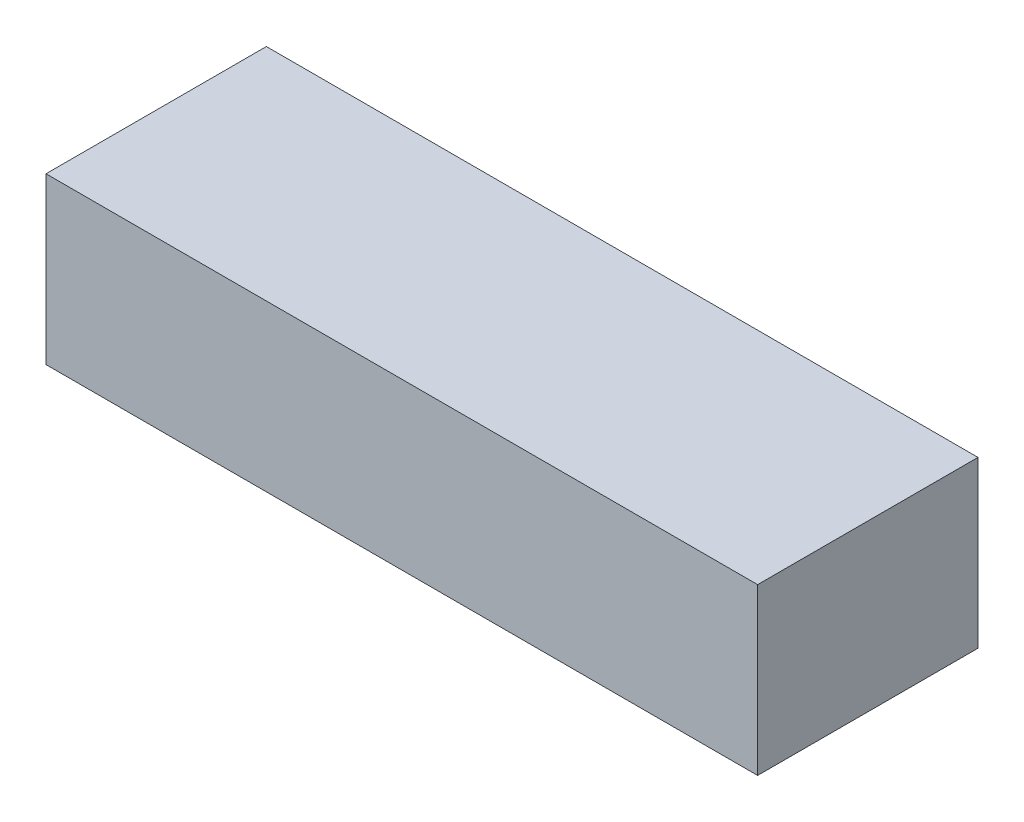
ISO-10303-21;
HEADER;
FILE_DESCRIPTION(('STEP AP214'),'2;1');
FILE_NAME('part.step','',(''),(''),'','','');
FILE_SCHEMA(('AUTOMOTIVE_DESIGN { 1 0 10303 214 1 1 1 1 }'));
ENDSEC;
DATA;
#1=APPLICATION_CONTEXT('core data for automotive mechanical design processes');
#2=APPLICATION_PROTOCOL_DEFINITION('international standard','automotive_design',2000,#1);
#3=PRODUCT_CONTEXT('',#1,'mechanical');
#4=PRODUCT('Part','Part','',(#3));
#5=PRODUCT_RELATED_PRODUCT_CATEGORY('part','',(#4));
#6=PRODUCT_DEFINITION_FORMATION('','',#4);
#7=PRODUCT_DEFINITION_CONTEXT('part definition',#1,'design');
#8=PRODUCT_DEFINITION('design','',#6,#7);
#9=PRODUCT_DEFINITION_SHAPE('','',#8);
#10=(LENGTH_UNIT() NAMED_UNIT(*) SI_UNIT(.MILLI.,.METRE.));
#11=(NAMED_UNIT(*) PLANE_ANGLE_UNIT() SI_UNIT($,.RADIAN.));
#12=(NAMED_UNIT(*) SI_UNIT($,.STERADIAN.) SOLID_ANGLE_UNIT());
#13=UNCERTAINTY_MEASURE_WITH_UNIT(LENGTH_MEASURE(1.E-05),#10,'distance_accuracy_value','');
#14=(GEOMETRIC_REPRESENTATION_CONTEXT(3) GLOBAL_UNCERTAINTY_ASSIGNED_CONTEXT((#13)) GLOBAL_UNIT_ASSIGNED_CONTEXT((#10,
#11,#12)) REPRESENTATION_CONTEXT('',''));
#15=CARTESIAN_POINT('',(0.,0.,0.));
#16=DIRECTION('',(0.,0.,1.));
#17=DIRECTION('',(1.,0.,0.));
#18=AXIS2_PLACEMENT_3D('',#15,#16,#17);
#19=CARTESIAN_POINT('',(0.,36.,0.));
#20=DIRECTION('',(1.,0.,0.));
#21=DIRECTION('',(0.,0.,-1.));
#22=AXIS2_PLACEMENT_3D('',#19,#20,#21);
#23=PLANE('',#22);
#24=DIRECTION('',(0.,0.,-1.));
#25=VECTOR('',#24,1.);
#26=CARTESIAN_POINT('',(0.,23.5446486102546,0.));
#27=LINE('',#26,#25);
#28=CARTESIAN_POINT('',(0.,23.5446486102546,11.2079706550077));
#29=VERTEX_POINT('',#28);
#30=CARTESIAN_POINT('',(0.,23.5446486102546,0.));
#31=VERTEX_POINT('',#30);
#32=EDGE_CURVE('E60',#29,#31,#27,.T.);
#33=ORIENTED_EDGE('',*,*,#32,.F.);
#34=DIRECTION('',(0.,1.,0.));
#35=VECTOR('',#34,1.);
#36=CARTESIAN_POINT('',(0.,23.5446486102546,11.2079706550077));
#37=LINE('',#36,#35);
#38=CARTESIAN_POINT('',(0.,12.8736854339166,11.2079706550077));
#39=VERTEX_POINT('',#38);
#40=EDGE_CURVE('E283',#39,#29,#37,.T.);
#41=ORIENTED_EDGE('',*,*,#40,.F.);
#42=DIRECTION('',(0.,0.,1.));
#43=VECTOR('',#42,1.);
#44=CARTESIAN_POINT('',(0.,12.8736854339166,0.));
#45=LINE('',#44,#43);
#46=CARTESIAN_POINT('',(0.,12.8736854339166,0.));
#47=VERTEX_POINT('',#46);
#48=EDGE_CURVE('E66',#47,#39,#45,.T.);
#49=ORIENTED_EDGE('',*,*,#48,.F.);
#50=DIRECTION('',(0.,-1.,0.));
#51=VECTOR('',#50,1.);
#52=CARTESIAN_POINT('',(0.,36.,0.));
#53=LINE('',#52,#51);
#54=CARTESIAN_POINT('',(0.,0.,0.));
#55=VERTEX_POINT('',#54);
#56=EDGE_CURVE('E133',#47,#55,#53,.T.);
#57=ORIENTED_EDGE('',*,*,#56,.T.);
#58=DIRECTION('',(0.,0.,1.));
#59=VECTOR('',#58,1.);
#60=CARTESIAN_POINT('',(0.,0.,0.));
#61=LINE('',#60,#59);
#62=CARTESIAN_POINT('',(0.,0.,48.));
#63=VERTEX_POINT('',#62);
#64=EDGE_CURVE('E135',#55,#63,#61,.T.);
#65=ORIENTED_EDGE('',*,*,#64,.T.);
#66=DIRECTION('',(0.,-1.,0.));
#67=VECTOR('',#66,1.);
#68=CARTESIAN_POINT('',(0.,36.,48.));
#69=LINE('',#68,#67);
#70=CARTESIAN_POINT('',(0.,36.,48.));
#71=VERTEX_POINT('',#70);
#72=EDGE_CURVE('E11',#71,#63,#69,.T.);
#73=ORIENTED_EDGE('',*,*,#72,.F.);
#74=DIRECTION('',(0.,0.,1.));
#75=VECTOR('',#74,1.);
#76=CARTESIAN_POINT('',(0.,36.,0.));
#77=LINE('',#76,#75);
#78=CARTESIAN_POINT('',(0.,36.,0.));
#79=VERTEX_POINT('',#78);
#80=EDGE_CURVE('E146',#79,#71,#77,.T.);
#81=ORIENTED_EDGE('',*,*,#80,.F.);
#82=EDGE_CURVE('E167',#79,#31,#53,.T.);
#83=ORIENTED_EDGE('',*,*,#82,.T.);
#84=EDGE_LOOP('',(#33,#41,#49,#57,#65,#73,#81,#83));
#85=FACE_BOUND('',#84,.T.);
#86=ADVANCED_FACE('F45',(#85),#23,.F.);
#87=CARTESIAN_POINT('',(0.,36.,48.));
#88=DIRECTION('',(0.,0.,-1.));
#89=DIRECTION('',(-1.,0.,0.));
#90=AXIS2_PLACEMENT_3D('',#87,#88,#89);
#91=PLANE('',#90);
#92=DIRECTION('',(1.,0.,0.));
#93=VECTOR('',#92,1.);
#94=CARTESIAN_POINT('',(0.,0.,48.));
#95=LINE('',#94,#93);
#96=CARTESIAN_POINT('',(155.,0.,48.));
#97=VERTEX_POINT('',#96);
#98=EDGE_CURVE('E140',#63,#97,#95,.T.);
#99=ORIENTED_EDGE('',*,*,#98,.T.);
#100=DIRECTION('',(0.,-1.,0.));
#101=VECTOR('',#100,1.);
#102=CARTESIAN_POINT('',(155.,36.,48.));
#103=LINE('',#102,#101);
#104=CARTESIAN_POINT('',(155.,36.,48.));
#105=VERTEX_POINT('',#104);
#106=EDGE_CURVE('E53',#105,#97,#103,.T.);
#107=ORIENTED_EDGE('',*,*,#106,.F.);
#108=DIRECTION('',(1.,0.,0.));
#109=VECTOR('',#108,1.);
#110=CARTESIAN_POINT('',(0.,36.,48.));
#111=LINE('',#110,#109);
#112=EDGE_CURVE('E150',#71,#105,#111,.T.);
#113=ORIENTED_EDGE('',*,*,#112,.F.);
#114=ORIENTED_EDGE('',*,*,#72,.T.);
#115=EDGE_LOOP('',(#99,#107,#113,#114));
#116=FACE_BOUND('',#115,.T.);
#117=ADVANCED_FACE('F192',(#116),#91,.F.);
#118=CARTESIAN_POINT('',(155.,36.,0.));
#119=DIRECTION('',(-1.,0.,0.));
#120=DIRECTION('',(0.,0.,1.));
#121=AXIS2_PLACEMENT_3D('',#118,#119,#120);
#122=PLANE('',#121);
#123=DIRECTION('',(0.,0.,-1.));
#124=VECTOR('',#123,1.);
#125=CARTESIAN_POINT('',(155.,0.,0.));
#126=LINE('',#125,#124);
#127=CARTESIAN_POINT('',(155.,0.,0.));
#128=VERTEX_POINT('',#127);
#129=EDGE_CURVE('E162',#97,#128,#126,.T.);
#130=ORIENTED_EDGE('',*,*,#129,.T.);
#131=DIRECTION('',(0.,-1.,0.));
#132=VECTOR('',#131,1.);
#133=CARTESIAN_POINT('',(155.,36.,0.));
#134=LINE('',#133,#132);
#135=CARTESIAN_POINT('',(155.,36.,0.));
#136=VERTEX_POINT('',#135);
#137=EDGE_CURVE('E170',#136,#128,#134,.T.);
#138=ORIENTED_EDGE('',*,*,#137,.F.);
#139=DIRECTION('',(0.,0.,-1.));
#140=VECTOR('',#139,1.);
#141=CARTESIAN_POINT('',(155.,36.,0.));
#142=LINE('',#141,#140);
#143=EDGE_CURVE('E154',#105,#136,#142,.T.);
#144=ORIENTED_EDGE('',*,*,#143,.F.);
#145=ORIENTED_EDGE('',*,*,#106,.T.);
#146=EDGE_LOOP('',(#130,#138,#144,#145));
#147=FACE_BOUND('',#146,.T.);
#148=ADVANCED_FACE('F179',(#147),#122,.F.);
#149=CARTESIAN_POINT('',(0.,36.,0.));
#150=DIRECTION('',(0.,0.,1.));
#151=DIRECTION('',(1.,0.,0.));
#152=AXIS2_PLACEMENT_3D('',#149,#150,#151);
#153=PLANE('',#152);
#154=DIRECTION('',(-1.,0.,0.));
#155=VECTOR('',#154,1.);
#156=CARTESIAN_POINT('',(0.,0.,0.));
#157=LINE('',#156,#155);
#158=EDGE_CURVE('E151',#128,#55,#157,.T.);
#159=ORIENTED_EDGE('',*,*,#158,.T.);
#160=ORIENTED_EDGE('',*,*,#56,.F.);
#161=DIRECTION('',(1.,0.,0.));
#162=VECTOR('',#161,1.);
#163=CARTESIAN_POINT('',(-10.,12.8736854339166,0.));
#164=LINE('',#163,#162);
#165=CARTESIAN_POINT('',(-10.,12.8736854339166,0.));
#166=VERTEX_POINT('',#165);
#167=EDGE_CURVE('E113',#166,#47,#164,.T.);
#168=ORIENTED_EDGE('',*,*,#167,.F.);
#169=DIRECTION('',(0.,-1.,0.));
#170=VECTOR('',#169,1.);
#171=CARTESIAN_POINT('',(-10.,23.5446486102546,0.));
#172=LINE('',#171,#170);
#173=CARTESIAN_POINT('',(-10.,23.5446486102546,0.));
#174=VERTEX_POINT('',#173);
#175=EDGE_CURVE('E120',#174,#166,#172,.T.);
#176=ORIENTED_EDGE('',*,*,#175,.F.);
#177=DIRECTION('',(1.,0.,0.));
#178=VECTOR('',#177,1.);
#179=CARTESIAN_POINT('',(-10.,23.5446486102546,0.));
#180=LINE('',#179,#178);
#181=EDGE_CURVE('E280',#174,#31,#180,.T.);
#182=ORIENTED_EDGE('',*,*,#181,.T.);
#183=ORIENTED_EDGE('',*,*,#82,.F.);
#184=DIRECTION('',(-1.,0.,0.));
#185=VECTOR('',#184,1.);
#186=CARTESIAN_POINT('',(0.,36.,0.));
#187=LINE('',#186,#185);
#188=EDGE_CURVE('E157',#136,#79,#187,.T.);
#189=ORIENTED_EDGE('',*,*,#188,.F.);
#190=ORIENTED_EDGE('',*,*,#137,.T.);
#191=EDGE_LOOP('',(#159,#160,#168,#176,#182,#183,#189,#190));
#192=FACE_BOUND('',#191,.T.);
#193=ADVANCED_FACE('F132',(#192),#153,.F.);
#194=CARTESIAN_POINT('',(0.,36.,0.));
#195=DIRECTION('',(0.,1.,0.));
#196=DIRECTION('',(0.,0.,1.));
#197=AXIS2_PLACEMENT_3D('',#194,#195,#196);
#198=PLANE('',#197);
#199=ORIENTED_EDGE('',*,*,#80,.T.);
#200=ORIENTED_EDGE('',*,*,#112,.T.);
#201=ORIENTED_EDGE('',*,*,#143,.T.);
#202=ORIENTED_EDGE('',*,*,#188,.T.);
#203=EDGE_LOOP('',(#199,#200,#201,#202));
#204=FACE_BOUND('',#203,.T.);
#205=ADVANCED_FACE('F190',(#204),#198,.T.);
#206=CARTESIAN_POINT('',(0.,0.,0.));
#207=DIRECTION('',(0.,1.,0.));
#208=DIRECTION('',(0.,0.,1.));
#209=AXIS2_PLACEMENT_3D('',#206,#207,#208);
#210=PLANE('',#209);
#211=ORIENTED_EDGE('',*,*,#64,.F.);
#212=ORIENTED_EDGE('',*,*,#158,.F.);
#213=ORIENTED_EDGE('',*,*,#129,.F.);
#214=ORIENTED_EDGE('',*,*,#98,.F.);
#215=EDGE_LOOP('',(#211,#212,#213,#214));
#216=FACE_BOUND('',#215,.T.);
#217=ADVANCED_FACE('F185',(#216),#210,.F.);
#218=CARTESIAN_POINT('',(-10.,12.8736854339166,0.));
#219=DIRECTION('',(0.,1.,0.));
#220=DIRECTION('',(0.,0.,1.));
#221=AXIS2_PLACEMENT_3D('',#218,#219,#220);
#222=PLANE('',#221);
#223=ORIENTED_EDGE('',*,*,#48,.T.);
#224=DIRECTION('',(1.,0.,0.));
#225=VECTOR('',#224,1.);
#226=CARTESIAN_POINT('',(-10.,12.8736854339166,11.2079706550077));
#227=LINE('',#226,#225);
#228=CARTESIAN_POINT('',(-10.,12.8736854339166,11.2079706550077));
#229=VERTEX_POINT('',#228);
#230=EDGE_CURVE('E115',#229,#39,#227,.T.);
#231=ORIENTED_EDGE('',*,*,#230,.F.);
#232=DIRECTION('',(0.,0.,1.));
#233=VECTOR('',#232,1.);
#234=CARTESIAN_POINT('',(-10.,12.8736854339166,0.));
#235=LINE('',#234,#233);
#236=EDGE_CURVE('E109',#166,#229,#235,.T.);
#237=ORIENTED_EDGE('',*,*,#236,.F.);
#238=ORIENTED_EDGE('',*,*,#167,.T.);
#239=EDGE_LOOP('',(#223,#231,#237,#238));
#240=FACE_BOUND('',#239,.T.);
#241=ADVANCED_FACE('F111',(#240),#222,.F.);
#242=CARTESIAN_POINT('',(-10.,23.5446486102546,11.2079706550077));
#243=DIRECTION('',(0.,0.,-1.));
#244=DIRECTION('',(-1.,0.,0.));
#245=AXIS2_PLACEMENT_3D('',#242,#243,#244);
#246=PLANE('',#245);
#247=ORIENTED_EDGE('',*,*,#40,.T.);
#248=DIRECTION('',(1.,0.,0.));
#249=VECTOR('',#248,1.);
#250=CARTESIAN_POINT('',(-10.,23.5446486102546,11.2079706550077));
#251=LINE('',#250,#249);
#252=CARTESIAN_POINT('',(-10.,23.5446486102546,11.2079706550077));
#253=VERTEX_POINT('',#252);
#254=EDGE_CURVE('E142',#253,#29,#251,.T.);
#255=ORIENTED_EDGE('',*,*,#254,.F.);
#256=DIRECTION('',(0.,1.,0.));
#257=VECTOR('',#256,1.);
#258=CARTESIAN_POINT('',(-10.,23.5446486102546,11.2079706550077));
#259=LINE('',#258,#257);
#260=EDGE_CURVE('E119',#229,#253,#259,.T.);
#261=ORIENTED_EDGE('',*,*,#260,.F.);
#262=ORIENTED_EDGE('',*,*,#230,.T.);
#263=EDGE_LOOP('',(#247,#255,#261,#262));
#264=FACE_BOUND('',#263,.T.);
#265=ADVANCED_FACE('F211',(#264),#246,.F.);
#266=CARTESIAN_POINT('',(-10.,23.5446486102546,0.));
#267=DIRECTION('',(0.,-1.,0.));
#268=DIRECTION('',(0.,0.,-1.));
#269=AXIS2_PLACEMENT_3D('',#266,#267,#268);
#270=PLANE('',#269);
#271=ORIENTED_EDGE('',*,*,#32,.T.);
#272=ORIENTED_EDGE('',*,*,#181,.F.);
#273=DIRECTION('',(0.,0.,-1.));
#274=VECTOR('',#273,1.);
#275=CARTESIAN_POINT('',(-10.,23.5446486102546,0.));
#276=LINE('',#275,#274);
#277=EDGE_CURVE('E125',#253,#174,#276,.T.);
#278=ORIENTED_EDGE('',*,*,#277,.F.);
#279=ORIENTED_EDGE('',*,*,#254,.T.);
#280=EDGE_LOOP('',(#271,#272,#278,#279));
#281=FACE_BOUND('',#280,.T.);
#282=ADVANCED_FACE('F214',(#281),#270,.F.);
#283=CARTESIAN_POINT('',(-10.,0.,0.));
#284=DIRECTION('',(-1.,0.,0.));
#285=DIRECTION('',(0.,0.,1.));
#286=AXIS2_PLACEMENT_3D('',#283,#284,#285);
#287=PLANE('',#286);
#288=ORIENTED_EDGE('',*,*,#175,.T.);
#289=ORIENTED_EDGE('',*,*,#236,.T.);
#290=ORIENTED_EDGE('',*,*,#260,.T.);
#291=ORIENTED_EDGE('',*,*,#277,.T.);
#292=EDGE_LOOP('',(#288,#289,#290,#291));
#293=FACE_BOUND('',#292,.T.);
#294=ADVANCED_FACE('F123',(#293),#287,.T.);
#295=CLOSED_SHELL('',(#86,#117,#148,#193,#205,#217,#241,#265,#282,#294));
#296=MANIFOLD_SOLID_BREP('B2',#295);
#297=ADVANCED_BREP_SHAPE_REPRESENTATION('',(#18,#296),#14);
#298=SHAPE_DEFINITION_REPRESENTATION(#9,#297);
ENDSEC;
END-ISO-10303-21;
